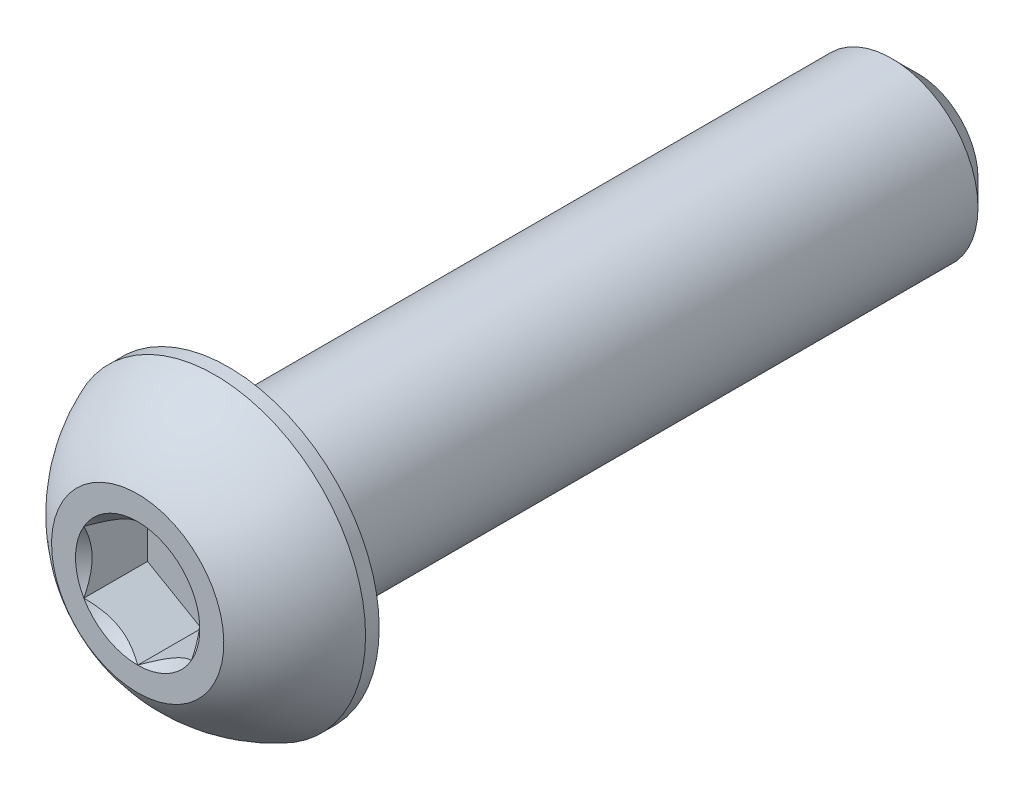
ISO-10303-21;
HEADER;
FILE_DESCRIPTION(('STEP AP214'),'2;1');
FILE_NAME('part.step','',(''),(''),'','','');
FILE_SCHEMA(('AUTOMOTIVE_DESIGN { 1 0 10303 214 1 1 1 1 }'));
ENDSEC;
DATA;
#1=APPLICATION_CONTEXT('core data for automotive mechanical design processes');
#2=APPLICATION_PROTOCOL_DEFINITION('international standard','automotive_design',2000,#1);
#3=PRODUCT_CONTEXT('',#1,'mechanical');
#4=PRODUCT('Part','Part','',(#3));
#5=PRODUCT_RELATED_PRODUCT_CATEGORY('part','',(#4));
#6=PRODUCT_DEFINITION_FORMATION('','',#4);
#7=PRODUCT_DEFINITION_CONTEXT('part definition',#1,'design');
#8=PRODUCT_DEFINITION('design','',#6,#7);
#9=PRODUCT_DEFINITION_SHAPE('','',#8);
#10=(LENGTH_UNIT() NAMED_UNIT(*) SI_UNIT(.MILLI.,.METRE.));
#11=(NAMED_UNIT(*) PLANE_ANGLE_UNIT() SI_UNIT($,.RADIAN.));
#12=(NAMED_UNIT(*) SI_UNIT($,.STERADIAN.) SOLID_ANGLE_UNIT());
#13=UNCERTAINTY_MEASURE_WITH_UNIT(LENGTH_MEASURE(1.E-05),#10,'distance_accuracy_value','');
#14=(GEOMETRIC_REPRESENTATION_CONTEXT(3) GLOBAL_UNCERTAINTY_ASSIGNED_CONTEXT((#13)) GLOBAL_UNIT_ASSIGNED_CONTEXT((#10,
#11,#12)) REPRESENTATION_CONTEXT('',''));
#15=CARTESIAN_POINT('',(0.,0.,0.));
#16=DIRECTION('',(0.,0.,1.));
#17=DIRECTION('',(1.,0.,0.));
#18=AXIS2_PLACEMENT_3D('',#15,#16,#17);
#19=CARTESIAN_POINT('',(0.,-3.175,-28.7528));
#20=DIRECTION('',(0.,0.,-1.));
#21=DIRECTION('',(0.,1.,0.));
#22=AXIS2_PLACEMENT_3D('',#19,#20,#21);
#23=PLANE('',#22);
#24=CARTESIAN_POINT('',(0.,0.,-28.7528));
#25=DIRECTION('',(0.,0.,-1.));
#26=DIRECTION('',(0.,1.,0.));
#27=AXIS2_PLACEMENT_3D('',#24,#25,#26);
#28=CIRCLE('',#27,2.22250000000001);
#29=CARTESIAN_POINT('',(0.,-2.2225,-28.7528));
#30=VERTEX_POINT('',#29);
#31=EDGE_CURVE('E175',#30,#30,#28,.T.);
#32=ORIENTED_EDGE('',*,*,#31,.T.);
#33=EDGE_LOOP('',(#32));
#34=FACE_BOUND('',#33,.T.);
#35=ADVANCED_FACE('F35',(#34),#23,.T.);
#36=CARTESIAN_POINT('',(0.,0.,-28.7528));
#37=DIRECTION('',(0.,0.,-1.));
#38=DIRECTION('',(0.,1.,0.));
#39=AXIS2_PLACEMENT_3D('',#36,#37,#38);
#40=CYLINDRICAL_SURFACE('',#39,3.175);
#41=CARTESIAN_POINT('',(0.,0.,-27.8003));
#42=DIRECTION('',(0.,0.,-1.));
#43=DIRECTION('',(0.,1.,0.));
#44=AXIS2_PLACEMENT_3D('',#41,#42,#43);
#45=CIRCLE('',#44,3.175);
#46=CARTESIAN_POINT('',(0.,-3.175,-27.8003));
#47=VERTEX_POINT('',#46);
#48=EDGE_CURVE('E49',#47,#47,#45,.F.);
#49=ORIENTED_EDGE('',*,*,#48,.T.);
#50=EDGE_LOOP('',(#49));
#51=FACE_BOUND('',#50,.T.);
#52=CARTESIAN_POINT('',(0.,0.,-3.3528));
#53=DIRECTION('',(0.,0.,1.));
#54=DIRECTION('',(1.,0.,0.));
#55=AXIS2_PLACEMENT_3D('',#52,#53,#54);
#56=CIRCLE('',#55,3.175);
#57=CARTESIAN_POINT('',(3.175,0.,-3.3528));
#58=VERTEX_POINT('',#57);
#59=EDGE_CURVE('E172',#58,#58,#56,.F.);
#60=ORIENTED_EDGE('',*,*,#59,.T.);
#61=EDGE_LOOP('',(#60));
#62=FACE_BOUND('',#61,.T.);
#63=ADVANCED_FACE('F180',(#51,#62),#40,.T.);
#64=CARTESIAN_POINT('',(0.,0.,-28.7528));
#65=DIRECTION('',(0.,0.,1.));
#66=DIRECTION('',(0.,-1.,0.));
#67=AXIS2_PLACEMENT_3D('',#64,#65,#66);
#68=CONICAL_SURFACE('',#67,2.22250000000001,0.785398163397445);
#69=CARTESIAN_POINT('',(0.,-3.175,-27.8003));
#70=CARTESIAN_POINT('',(0.,-3.165078125,-27.810221875));
#71=CARTESIAN_POINT('',(0.,-3.15515625,-27.82014375));
#72=CARTESIAN_POINT('',(0.,-3.1353125,-27.8399875));
#73=CARTESIAN_POINT('',(0.,-3.125390625,-27.849909375));
#74=CARTESIAN_POINT('',(0.,-3.105546875,-27.869753125));
#75=CARTESIAN_POINT('',(0.,-3.095625,-27.879675));
#76=CARTESIAN_POINT('',(0.,-3.07578125,-27.89951875));
#77=CARTESIAN_POINT('',(0.,-3.065859375,-27.909440625));
#78=CARTESIAN_POINT('',(0.,-3.046015625,-27.929284375));
#79=CARTESIAN_POINT('',(0.,-3.03609375,-27.93920625));
#80=CARTESIAN_POINT('',(0.,-3.01625,-27.95905));
#81=CARTESIAN_POINT('',(0.,-3.006328125,-27.968971875));
#82=CARTESIAN_POINT('',(0.,-2.986484375,-27.988815625));
#83=CARTESIAN_POINT('',(0.,-2.9765625,-27.9987375));
#84=CARTESIAN_POINT('',(0.,-2.95671875,-28.01858125));
#85=CARTESIAN_POINT('',(0.,-2.946796875,-28.028503125));
#86=CARTESIAN_POINT('',(0.,-2.926953125,-28.048346875));
#87=CARTESIAN_POINT('',(0.,-2.91703125,-28.05826875));
#88=CARTESIAN_POINT('',(0.,-2.8971875,-28.0781125));
#89=CARTESIAN_POINT('',(0.,-2.887265625,-28.088034375));
#90=CARTESIAN_POINT('',(0.,-2.867421875,-28.107878125));
#91=CARTESIAN_POINT('',(0.,-2.8575,-28.1178));
#92=CARTESIAN_POINT('',(0.,-2.83765625,-28.13764375));
#93=CARTESIAN_POINT('',(0.,-2.827734375,-28.147565625));
#94=CARTESIAN_POINT('',(0.,-2.807890625,-28.167409375));
#95=CARTESIAN_POINT('',(0.,-2.79796875,-28.17733125));
#96=CARTESIAN_POINT('',(0.,-2.778125,-28.197175));
#97=CARTESIAN_POINT('',(0.,-2.768203125,-28.207096875));
#98=CARTESIAN_POINT('',(0.,-2.748359375,-28.226940625));
#99=CARTESIAN_POINT('',(0.,-2.7384375,-28.2368625));
#100=CARTESIAN_POINT('',(0.,-2.71859375,-28.25670625));
#101=CARTESIAN_POINT('',(0.,-2.708671875,-28.266628125));
#102=CARTESIAN_POINT('',(0.,-2.688828125,-28.286471875));
#103=CARTESIAN_POINT('',(0.,-2.67890625,-28.29639375));
#104=CARTESIAN_POINT('',(0.,-2.6590625,-28.3162375));
#105=CARTESIAN_POINT('',(0.,-2.649140625,-28.326159375));
#106=CARTESIAN_POINT('',(0.,-2.629296875,-28.346003125));
#107=CARTESIAN_POINT('',(0.,-2.619375,-28.355925));
#108=CARTESIAN_POINT('',(0.,-2.59953125,-28.37576875));
#109=CARTESIAN_POINT('',(0.,-2.589609375,-28.385690625));
#110=CARTESIAN_POINT('',(0.,-2.569765625,-28.405534375));
#111=CARTESIAN_POINT('',(0.,-2.55984375,-28.41545625));
#112=CARTESIAN_POINT('',(0.,-2.54,-28.4353));
#113=CARTESIAN_POINT('',(0.,-2.530078125,-28.445221875));
#114=CARTESIAN_POINT('',(0.,-2.510234375,-28.465065625));
#115=CARTESIAN_POINT('',(0.,-2.5003125,-28.4749875));
#116=CARTESIAN_POINT('',(0.,-2.48046875,-28.49483125));
#117=CARTESIAN_POINT('',(0.,-2.470546875,-28.504753125));
#118=CARTESIAN_POINT('',(0.,-2.450703125,-28.524596875));
#119=CARTESIAN_POINT('',(0.,-2.44078125,-28.53451875));
#120=CARTESIAN_POINT('',(0.,-2.4209375,-28.5543625));
#121=CARTESIAN_POINT('',(0.,-2.411015625,-28.564284375));
#122=CARTESIAN_POINT('',(0.,-2.391171875,-28.584128125));
#123=CARTESIAN_POINT('',(0.,-2.38125,-28.59405));
#124=CARTESIAN_POINT('',(0.,-2.36140625,-28.61389375));
#125=CARTESIAN_POINT('',(0.,-2.351484375,-28.623815625));
#126=CARTESIAN_POINT('',(0.,-2.331640625,-28.643659375));
#127=CARTESIAN_POINT('',(0.,-2.32171875,-28.65358125));
#128=CARTESIAN_POINT('',(0.,-2.301875,-28.673425));
#129=CARTESIAN_POINT('',(0.,-2.291953125,-28.683346875));
#130=CARTESIAN_POINT('',(0.,-2.272109375,-28.703190625));
#131=CARTESIAN_POINT('',(0.,-2.2621875,-28.7131125));
#132=CARTESIAN_POINT('',(0.,-2.24234375,-28.73295625));
#133=CARTESIAN_POINT('',(0.,-2.232421875,-28.742878125));
#134=CARTESIAN_POINT('',(0.,-2.2225,-28.7528));
#135=B_SPLINE_CURVE_WITH_KNOTS('',3,(#69,#70,#71,#72,#73,#74,#75,#76,#77,#78,#79,#80,#81,#82,
#83,#84,#85,#86,#87,#88,#89,#90,#91,#92,#93,#94,#95,#96,#97,#98,#99,#100,#101,#102,#103,#104,
#105,#106,#107,#108,#109,#110,#111,#112,#113,#114,#115,#116,#117,#118,#119,#120,#121,#122,#123,
#124,#125,#126,#127,#128,#129,#130,#131,#132,#133,#134),.UNSPECIFIED.,.F.,.F.,(4,2,2,2,2,2,2,2,
2,2,2,2,2,2,2,2,2,2,2,2,2,2,2,2,2,2,2,2,2,2,2,2,4),(0.,0.042094950567512,0.0841899011350244,
0.126284851702536,0.168379802270049,0.210474752837561,0.25256970340507,0.294664653972582,
0.336759604540094,0.378854555107606,0.420949505675118,0.463044456242628,0.50513940681014,
0.547234357377652,0.589329307945164,0.631424258512676,0.673519209080186,0.715614159647698,
0.75770911021521,0.799804060782722,0.841899011350235,0.883993961917747,0.926088912485256,
0.968183863052768,1.01027881362028,1.05237376418779,1.0944687147553,1.13656366532281,
1.17865861589033,1.22075356645784,1.26284851702535,1.30494346759286,1.34703841816037),.UNSPECIFIED.);
#136=EDGE_CURVE('BSEAM37',#47,#30,#135,.T.);
#137=ORIENTED_EDGE('',*,*,#48,.F.);
#138=ORIENTED_EDGE('',*,*,#31,.F.);
#139=ORIENTED_EDGE('',*,*,#136,.T.);
#140=ORIENTED_EDGE('',*,*,#136,.F.);
#141=EDGE_LOOP('',(#137,#139,#138,#140));
#142=FACE_BOUND('',#141,.T.);
#143=ADVANCED_FACE('F37',(#142),#68,.T.);
#144=CARTESIAN_POINT('',(0.,0.,-5.060315));
#145=DIRECTION('',(0.,0.,1.));
#146=DIRECTION('',(0.,-1.,0.));
#147=AXIS2_PLACEMENT_3D('',#144,#145,#146);
#148=SPHERICAL_SURFACE('',#147,5.97389428256184);
#149=CARTESIAN_POINT('',(0.,0.,0.));
#150=DIRECTION('',(0.,0.,1.));
#151=DIRECTION('',(1.,0.,0.));
#152=AXIS2_PLACEMENT_3D('',#149,#150,#151);
#153=CIRCLE('',#152,3.175);
#154=CARTESIAN_POINT('',(0.,-3.175,0.));
#155=VERTEX_POINT('',#154);
#156=EDGE_CURVE('E169',#155,#155,#153,.T.);
#157=CARTESIAN_POINT('',(0.,0.,-2.84988));
#158=DIRECTION('',(0.,0.,1.));
#159=DIRECTION('',(1.,0.,0.));
#160=AXIS2_PLACEMENT_3D('',#157,#158,#159);
#161=CIRCLE('',#160,5.5499);
#162=CARTESIAN_POINT('',(0.,-5.5499,-2.84988));
#163=VERTEX_POINT('',#162);
#164=EDGE_CURVE('E163',#163,#163,#161,.T.);
#165=CARTESIAN_POINT('',(0.,-3.175,0.));
#166=CARTESIAN_POINT('',(0.,-3.20828343957184,-0.0208830076580502));
#167=CARTESIAN_POINT('',(0.,-3.24136078860705,-0.0420944789280503));
#168=CARTESIAN_POINT('',(0.,-3.30709055775141,-0.0851658910984718));
#169=CARTESIAN_POINT('',(0.,-3.33974297786056,-0.107025831998893));
#170=CARTESIAN_POINT('',(0.,-3.40461014130008,-0.151385725836676));
#171=CARTESIAN_POINT('',(0.,-3.43682488463043,-0.173885678774039));
#172=CARTESIAN_POINT('',(0.,-3.50080416139461,-0.219516822259479));
#173=CARTESIAN_POINT('',(0.,-3.53256869482844,-0.242648012807557));
#174=CARTESIAN_POINT('',(0.,-3.59563518208834,-0.289532629449102));
#175=CARTESIAN_POINT('',(0.,-3.62693713591442,-0.313286055542569));
#176=CARTESIAN_POINT('',(0.,-3.68906627753106,-0.36140589409133));
#177=CARTESIAN_POINT('',(0.,-3.71989346532163,-0.385772306546626));
#178=CARTESIAN_POINT('',(0.,-3.78106107243204,-0.435108631276877));
#179=CARTESIAN_POINT('',(0.,-3.8114014917519,-0.460078543551833));
#180=CARTESIAN_POINT('',(0.,-3.87158374923259,-0.510612146063938));
#181=CARTESIAN_POINT('',(0.,-3.90142558739343,-0.536175836301086));
#182=CARTESIAN_POINT('',(0.,-3.96059906392414,-0.587887041792083));
#183=CARTESIAN_POINT('',(0.,-3.989930702294,-0.614034557045931));
#184=CARTESIAN_POINT('',(0.,-4.04807235926832,-0.666903232293407));
#185=CARTESIAN_POINT('',(0.,-4.07688237787279,-0.693624392287034));
#186=CARTESIAN_POINT('',(0.,-4.13396957842491,-0.747629953401057));
#187=CARTESIAN_POINT('',(0.,-4.16224676037257,-0.774914354521453));
#188=CARTESIAN_POINT('',(0.,-4.21825727817542,-0.830035774981947));
#189=CARTESIAN_POINT('',(0.,-4.24599061403061,-0.857872794322045));
#190=CARTESIAN_POINT('',(0.,-4.30090264195357,-0.91408861315902));
#191=CARTESIAN_POINT('',(0.,-4.32808133402134,-0.942467412655899));
#192=CARTESIAN_POINT('',(0.,-4.38187349261953,-0.999755742806741));
#193=CARTESIAN_POINT('',(0.,-4.40848695914995,-1.0286652734607));
#194=CARTESIAN_POINT('',(0.,-4.46113830498838,-1.08700381029123));
#195=CARTESIAN_POINT('',(0.,-4.48717618429639,-1.11643281646778));
#196=CARTESIAN_POINT('',(0.,-4.53866621810402,-1.17579884645643));
#197=CARTESIAN_POINT('',(0.,-4.56411837260364,-1.20573587026853));
#198=CARTESIAN_POINT('',(0.,-4.61442704725457,-1.26610627984964));
#199=CARTESIAN_POINT('',(0.,-4.63928356740587,-1.29653966561866));
#200=CARTESIAN_POINT('',(0.,-4.68839129572448,-1.3578909501815));
#201=CARTESIAN_POINT('',(0.,-4.71264250389178,-1.38880884897531));
#202=CARTESIAN_POINT('',(0.,-4.76053016627881,-1.45111712201534));
#203=CARTESIAN_POINT('',(0.,-4.78416662049853,-1.48250749626155));
#204=CARTESIAN_POINT('',(0.,-4.8308155723751,-1.54574849868041));
#205=CARTESIAN_POINT('',(0.,-4.85382807003194,-1.57759912685306));
#206=CARTESIAN_POINT('',(0.,-4.89922014909859,-1.64174823640362));
#207=CARTESIAN_POINT('',(0.,-4.92159973050841,-1.67404671778154));
#208=CARTESIAN_POINT('',(0.,-4.96571726381658,-1.73907895865427));
#209=CARTESIAN_POINT('',(0.,-4.98745521571493,-1.77181271814908));
#210=CARTESIAN_POINT('',(0.,-5.03028102654719,-1.83770277069632));
#211=CARTESIAN_POINT('',(0.,-5.0513688854811,-1.87085906374874));
#212=CARTESIAN_POINT('',(0.,-5.09288630004063,-1.93758127434189));
#213=CARTESIAN_POINT('',(0.,-5.11331585566624,-1.97114719188261));
#214=CARTESIAN_POINT('',(0.,-5.15350870956168,-2.03867558290299));
#215=CARTESIAN_POINT('',(0.,-5.17327200783151,-2.07263805638265));
#216=CARTESIAN_POINT('',(0.,-5.21212465239608,-2.14094633632486));
#217=CARTESIAN_POINT('',(0.,-5.23121399869082,-2.17529214278741));
#218=CARTESIAN_POINT('',(0.,-5.26871130697935,-2.2443537165359));
#219=CARTESIAN_POINT('',(0.,-5.28711926897315,-2.27906948382184));
#220=CARTESIAN_POINT('',(0.,-5.32324664200827,-2.3488574628552));
#221=CARTESIAN_POINT('',(0.,-5.3409660530496,-2.38392967460262));
#222=CARTESIAN_POINT('',(0.,-5.37570942417474,-2.45441688802313));
#223=CARTESIAN_POINT('',(0.,-5.39273338425856,-2.48983188969622));
#224=CARTESIAN_POINT('',(0.,-5.42607922958184,-2.56099089271574));
#225=CARTESIAN_POINT('',(0.,-5.44240111482132,-2.59673489406217));
#226=CARTESIAN_POINT('',(0.,-5.47433643994316,-2.66853798649801));
#227=CARTESIAN_POINT('',(0.,-5.48994987982553,-2.70459707758742));
#228=CARTESIAN_POINT('',(0.,-5.52046229408188,-2.77701628549785));
#229=CARTESIAN_POINT('',(0.,-5.53536126845586,-2.81337640231887));
#230=CARTESIAN_POINT('',(0.,-5.5499,-2.84988));
#231=B_SPLINE_CURVE_WITH_KNOTS('',3,(#165,#166,#167,#168,#169,#170,#171,#172,#173,#174,#175,
#176,#177,#178,#179,#180,#181,#182,#183,#184,#185,#186,#187,#188,#189,#190,#191,#192,#193,#194,
#195,#196,#197,#198,#199,#200,#201,#202,#203,#204,#205,#206,#207,#208,#209,#210,#211,#212,#213,
#214,#215,#216,#217,#218,#219,#220,#221,#222,#223,#224,#225,#226,#227,#228,#229,#230),
.UNSPECIFIED.,.F.,.F.,(4,2,2,2,2,2,2,2,2,2,2,2,2,2,2,2,2,2,2,2,2,2,2,2,2,2,2,2,2,2,2,2,4),(0.,
0.1178750807537,0.235750161507399,0.353625242261099,0.471500323014798,0.589375403768498,
0.707250484522198,0.825125565275897,0.943000646029597,1.0608757267833,1.17875080753699,
1.2966258882907,1.41450096904439,1.53237604979809,1.65025113055179,1.76812621130549,
1.88600129205919,2.00387637281289,2.12175145356659,2.23962653432029,2.35750161507399,
2.47537669582769,2.59325177658139,2.71112685733509,2.82900193808879,2.94687701884249,
3.06475209959619,3.18262718034989,3.30050226110359,3.41837734185729,3.53625242261099,
3.65412750336469,3.77200258411839),.UNSPECIFIED.);
#232=EDGE_CURVE('BSEAM185',#155,#163,#231,.T.);
#233=ORIENTED_EDGE('',*,*,#156,.F.);
#234=ORIENTED_EDGE('',*,*,#164,.T.);
#235=ORIENTED_EDGE('',*,*,#232,.T.);
#236=ORIENTED_EDGE('',*,*,#232,.F.);
#237=EDGE_LOOP('',(#233,#235,#234,#236));
#238=FACE_BOUND('',#237,.T.);
#239=ADVANCED_FACE('F185',(#238),#148,.T.);
#240=CARTESIAN_POINT('',(0.,-3.175,0.));
#241=DIRECTION('',(0.,0.,-1.));
#242=DIRECTION('',(-1.,0.,0.));
#243=AXIS2_PLACEMENT_3D('',#240,#241,#242);
#244=PLANE('',#243);
#245=CARTESIAN_POINT('',(0.,0.,0.));
#246=DIRECTION('',(0.,0.,1.));
#247=DIRECTION('',(1.,0.,0.));
#248=AXIS2_PLACEMENT_3D('',#245,#246,#247);
#249=CIRCLE('',#248,2.29135888084633);
#250=CARTESIAN_POINT('',(-1.984375,1.14567944042316,0.));
#251=VERTEX_POINT('',#250);
#252=CARTESIAN_POINT('',(-1.984375,-1.14567944042316,0.));
#253=VERTEX_POINT('',#252);
#254=EDGE_CURVE('E62',#251,#253,#249,.T.);
#255=ORIENTED_EDGE('',*,*,#254,.F.);
#256=CARTESIAN_POINT('',(0.,2.29135888084633,0.));
#257=VERTEX_POINT('',#256);
#258=EDGE_CURVE('E134',#257,#251,#249,.T.);
#259=ORIENTED_EDGE('',*,*,#258,.F.);
#260=CARTESIAN_POINT('',(1.984375,1.14567944042316,0.));
#261=VERTEX_POINT('',#260);
#262=EDGE_CURVE('E131',#261,#257,#249,.T.);
#263=ORIENTED_EDGE('',*,*,#262,.F.);
#264=CARTESIAN_POINT('',(1.984375,-1.14567944042316,0.));
#265=VERTEX_POINT('',#264);
#266=EDGE_CURVE('E102',#265,#261,#249,.T.);
#267=ORIENTED_EDGE('',*,*,#266,.F.);
#268=CARTESIAN_POINT('',(0.,-2.29135888084633,0.));
#269=VERTEX_POINT('',#268);
#270=EDGE_CURVE('E94',#269,#265,#249,.T.);
#271=ORIENTED_EDGE('',*,*,#270,.F.);
#272=EDGE_CURVE('E55',#253,#269,#249,.T.);
#273=ORIENTED_EDGE('',*,*,#272,.F.);
#274=EDGE_LOOP('',(#255,#259,#263,#267,#271,#273));
#275=FACE_BOUND('',#274,.T.);
#276=ORIENTED_EDGE('',*,*,#156,.T.);
#277=EDGE_LOOP('',(#276));
#278=FACE_BOUND('',#277,.T.);
#279=ADVANCED_FACE('F128',(#275,#278),#244,.F.);
#280=CARTESIAN_POINT('',(0.,-5.5499,-3.3528));
#281=DIRECTION('',(0.,0.,1.));
#282=DIRECTION('',(1.,0.,0.));
#283=AXIS2_PLACEMENT_3D('',#280,#281,#282);
#284=PLANE('',#283);
#285=ORIENTED_EDGE('',*,*,#59,.F.);
#286=EDGE_LOOP('',(#285));
#287=FACE_BOUND('',#286,.T.);
#288=CARTESIAN_POINT('',(0.,0.,-3.3528));
#289=DIRECTION('',(0.,0.,1.));
#290=DIRECTION('',(1.,0.,0.));
#291=AXIS2_PLACEMENT_3D('',#288,#289,#290);
#292=CIRCLE('',#291,5.5499);
#293=CARTESIAN_POINT('',(5.5499,0.,-3.3528));
#294=VERTEX_POINT('',#293);
#295=EDGE_CURVE('E166',#294,#294,#292,.T.);
#296=ORIENTED_EDGE('',*,*,#295,.F.);
#297=EDGE_LOOP('',(#296));
#298=FACE_BOUND('',#297,.T.);
#299=ADVANCED_FACE('F199',(#287,#298),#284,.F.);
#300=CARTESIAN_POINT('',(0.,0.,0.));
#301=DIRECTION('',(0.,0.,1.));
#302=DIRECTION('',(1.,0.,0.));
#303=AXIS2_PLACEMENT_3D('',#300,#301,#302);
#304=CYLINDRICAL_SURFACE('',#303,5.5499);
#305=ORIENTED_EDGE('',*,*,#164,.F.);
#306=EDGE_LOOP('',(#305));
#307=FACE_BOUND('',#306,.T.);
#308=ORIENTED_EDGE('',*,*,#295,.T.);
#309=EDGE_LOOP('',(#308));
#310=FACE_BOUND('',#309,.T.);
#311=ADVANCED_FACE('F202',(#307,#310),#304,.T.);
#312=CARTESIAN_POINT('',(0.,0.,0.));
#313=DIRECTION('',(0.,0.,1.));
#314=DIRECTION('',(1.,0.,0.));
#315=AXIS2_PLACEMENT_3D('',#312,#313,#314);
#316=CONICAL_SURFACE('',#315,2.29135888084633,0.78539816339745);
#317=ORIENTED_EDGE('',*,*,#266,.T.);
#318=CARTESIAN_POINT('',(1.984375,-2.28495242157822,0.734984078816568));
#319=CARTESIAN_POINT('',(1.984375,-2.22931635455402,0.692986685550762));
#320=CARTESIAN_POINT('',(1.984375,-2.17336876548389,0.651396054076336));
#321=CARTESIAN_POINT('',(1.984375,-2.06072770258171,0.569208461471479));
#322=CARTESIAN_POINT('',(1.984375,-2.00403404503435,0.528611752405042));
#323=CARTESIAN_POINT('',(1.984375,-1.88936329173488,0.448303503174668));
#324=CARTESIAN_POINT('',(1.984375,-1.83137965519348,0.408601258813307));
#325=CARTESIAN_POINT('',(1.984375,-1.7144280213784,0.330685173401292));
#326=CARTESIAN_POINT('',(1.984375,-1.65546009407228,0.292471227194368));
#327=CARTESIAN_POINT('',(1.984375,-1.47005472306035,0.176252834013637));
#328=CARTESIAN_POINT('',(1.984375,-1.34163909427883,0.101347886872381));
#329=CARTESIAN_POINT('',(1.984375,-1.0784038470548,-0.0356697845602627));
#330=CARTESIAN_POINT('',(1.984375,-0.943607781407424,-0.0978256335176254));
#331=CARTESIAN_POINT('',(1.984375,-0.741275100444881,-0.173867421311381));
#332=CARTESIAN_POINT('',(1.984375,-0.676735408881095,-0.195691938673995));
#333=CARTESIAN_POINT('',(1.984375,-0.546098118112761,-0.234159536462205));
#334=CARTESIAN_POINT('',(1.984375,-0.480000411919955,-0.250802259934452));
#335=CARTESIAN_POINT('',(1.984375,-0.347746170028531,-0.277764619130277));
#336=CARTESIAN_POINT('',(1.984375,-0.281612071479122,-0.288192590264109));
#337=CARTESIAN_POINT('',(1.984375,-0.14863662005235,-0.302521852623404));
#338=CARTESIAN_POINT('',(1.984375,-0.0817953907393235,-0.306424265772614));
#339=CARTESIAN_POINT('',(1.984375,0.0495156750890644,-0.307412948667327));
#340=CARTESIAN_POINT('',(1.984375,0.113983775102991,-0.304740821124985));
#341=CARTESIAN_POINT('',(1.984375,0.242367515846177,-0.293260789502485));
#342=CARTESIAN_POINT('',(1.984375,0.30628310229592,-0.284452289360786));
#343=CARTESIAN_POINT('',(1.984375,0.434181040262184,-0.261030978667103));
#344=CARTESIAN_POINT('',(1.984375,0.498145026858309,-0.246319393767914));
#345=CARTESIAN_POINT('',(1.984375,0.624675616953007,-0.211873818587874));
#346=CARTESIAN_POINT('',(1.984375,0.687242336899689,-0.192140248550805));
#347=CARTESIAN_POINT('',(1.984375,0.884225483826088,-0.12258776276924));
#348=CARTESIAN_POINT('',(1.984375,1.01583674256468,-0.0648475887435034));
#349=CARTESIAN_POINT('',(1.984375,1.27288659242652,0.063530336588798));
#350=CARTESIAN_POINT('',(1.984375,1.3983008827048,0.134214424919413));
#351=CARTESIAN_POINT('',(1.984375,1.57956687990221,0.244516663813199));
#352=CARTESIAN_POINT('',(1.984375,1.63738271299424,0.280969829475364));
#353=CARTESIAN_POINT('',(1.984375,1.75202215386202,0.355415963291705));
#354=CARTESIAN_POINT('',(1.984375,1.80884568601362,0.393409048078054));
#355=CARTESIAN_POINT('',(1.984375,1.92116923084255,0.470338808893091));
#356=CARTESIAN_POINT('',(1.984375,1.97667624512253,0.509265313038791));
#357=CARTESIAN_POINT('',(1.984375,2.08693170717166,0.588147746121386));
#358=CARTESIAN_POINT('',(1.984375,2.14168035934793,0.62810338902403));
#359=CARTESIAN_POINT('',(1.984375,2.19611149046622,0.668480611285427));
#360=B_SPLINE_CURVE_WITH_KNOTS('',3,(#318,#319,#320,#321,#322,#323,#324,#325,#326,#327,#328,
#329,#330,#331,#332,#333,#334,#335,#336,#337,#338,#339,#340,#341,#342,#343,#344,#345,#346,#347,
#348,#349,#350,#351,#352,#353,#354,#355,#356,#357,#358,#359),.UNSPECIFIED.,.F.,.F.,(4,2,2,2,2,2,
2,2,2,2,2,2,2,2,2,2,2,2,2,2,4),(0.,0.209126070008322,0.418304637356569,0.629103979977992,
0.839888401371185,1.28549951116127,1.72957750768351,1.93379389749971,2.13802435186698,
2.33858179514334,2.53910475350639,2.73236963400794,2.92565329006887,3.12231577097487,
3.31896180041345,3.74886295245172,4.18033428125362,4.3853601718029,4.59040161996383,
4.79377749165108,4.99709743524131),.UNSPECIFIED.);
#361=EDGE_CURVE('E11',#265,#261,#360,.T.);
#362=ORIENTED_EDGE('',*,*,#361,.F.);
#363=EDGE_LOOP('',(#317,#362));
#364=FACE_BOUND('',#363,.T.);
#365=ADVANCED_FACE('F106',(#364),#316,.F.);
#366=ORIENTED_EDGE('',*,*,#262,.T.);
#367=CARTESIAN_POINT('',(1.984575,1.14556397036933,0.000115478781843379));
#368=CARTESIAN_POINT('',(1.9163590048332,1.18494849354192,-0.0392371477360855));
#369=CARTESIAN_POINT('',(1.84700231489303,1.22499159714897,-0.0762786895538155));
#370=CARTESIAN_POINT('',(1.70557619954781,1.30664400291398,-0.144101141576677));
#371=CARTESIAN_POINT('',(1.63349332126322,1.34826107209555,-0.174844310908246));
#372=CARTESIAN_POINT('',(1.488141602734,1.43217992591557,-0.227508111188786));
#373=CARTESIAN_POINT('',(1.41490978751306,1.47446033414663,-0.249561124120036));
#374=CARTESIAN_POINT('',(1.26683381740529,1.55995203534886,-0.283538507056124));
#375=CARTESIAN_POINT('',(1.19199418724658,1.60316071596705,-0.295488243908271));
#376=CARTESIAN_POINT('',(1.06301458545618,1.6776271237807,-0.306269900918094));
#377=CARTESIAN_POINT('',(1.00904128422756,1.7087886237741,-0.30786610094093));
#378=CARTESIAN_POINT('',(0.901182881480199,1.77106070163465,-0.305178161134708));
#379=CARTESIAN_POINT('',(0.847297817514476,1.80217125782056,-0.300891959659541));
#380=CARTESIAN_POINT('',(0.740036461751395,1.86409863044402,-0.286683126986481));
#381=CARTESIAN_POINT('',(0.686660807239859,1.89491507894443,-0.276754189547727));
#382=CARTESIAN_POINT('',(0.580832482591103,1.95601509066828,-0.251804915725461));
#383=CARTESIAN_POINT('',(0.528379742028898,1.9862986945516,-0.236784969610512));
#384=CARTESIAN_POINT('',(0.394017661036351,2.06387267818152,-0.19219214836433));
#385=CARTESIAN_POINT('',(0.312941642841675,2.11068193911104,-0.159257004061667));
#386=CARTESIAN_POINT('',(0.19372669327016,2.17951072233758,-0.103657558797803));
#387=CARTESIAN_POINT('',(0.154440075613998,2.20219286161692,-0.0841224079481375));
#388=CARTESIAN_POINT('',(0.0765946381319467,2.24713694590237,-0.0432712618805984));
#389=CARTESIAN_POINT('',(0.0380353888983008,2.26939913882716,-0.0219563604316496));
#390=CARTESIAN_POINT('',(-0.00020000000000058,2.29147435090017,0.000115478781842942));
#391=B_SPLINE_CURVE_WITH_KNOTS('',3,(#367,#368,#369,#370,#371,#372,#373,#374,#375,#376,#377,
#378,#379,#380,#381,#382,#383,#384,#385,#386,#387,#388,#389,#390),.UNSPECIFIED.,.F.,.F.,(4,2,2,
2,2,2,2,2,2,2,2,4),(0.,0.264339630306627,0.530219665093694,0.79187641637146,1.05287424418109,
1.239639843932,1.42647091743852,1.61351120244035,1.8005371524754,2.09764209964316,
2.24579179873714,2.39385111134157),.UNSPECIFIED.);
#392=EDGE_CURVE('E133',#261,#257,#391,.T.);
#393=ORIENTED_EDGE('',*,*,#392,.F.);
#394=EDGE_LOOP('',(#366,#393));
#395=FACE_BOUND('',#394,.T.);
#396=ADVANCED_FACE('F287',(#395),#316,.F.);
#397=ORIENTED_EDGE('',*,*,#258,.T.);
#398=CARTESIAN_POINT('',(0.000199999999999608,2.29147435090017,0.000115478781843248));
#399=CARTESIAN_POINT('',(-0.0680159951668025,2.25208982772757,-0.0392371477360854));
#400=CARTESIAN_POINT('',(-0.137372685106966,2.21204672412052,-0.0762786895538155));
#401=CARTESIAN_POINT('',(-0.278798800452188,2.13039431835551,-0.144101141576677));
#402=CARTESIAN_POINT('',(-0.350881678736783,2.08877724917394,-0.174844310908246));
#403=CARTESIAN_POINT('',(-0.496233397266004,2.00485839535392,-0.227508111188786));
#404=CARTESIAN_POINT('',(-0.569465212486939,1.96257798712287,-0.249561124120036));
#405=CARTESIAN_POINT('',(-0.717541182594707,1.87708628592063,-0.283538507056124));
#406=CARTESIAN_POINT('',(-0.792380812753425,1.83387760530244,-0.295488243908272));
#407=CARTESIAN_POINT('',(-0.921360414543816,1.75941119748879,-0.306269900918094));
#408=CARTESIAN_POINT('',(-0.975333715772443,1.72824969749539,-0.307866100940931));
#409=CARTESIAN_POINT('',(-1.0831921185198,1.66597761963484,-0.305178161134708));
#410=CARTESIAN_POINT('',(-1.13707718248552,1.63486706344893,-0.300891959659541));
#411=CARTESIAN_POINT('',(-1.2443385382486,1.57293969082547,-0.286683126986481));
#412=CARTESIAN_POINT('',(-1.29771419276014,1.54212324232506,-0.276754189547727));
#413=CARTESIAN_POINT('',(-1.4035425174089,1.48102323060122,-0.251804915725462));
#414=CARTESIAN_POINT('',(-1.4559952579711,1.45073962671789,-0.236784969610512));
#415=CARTESIAN_POINT('',(-1.59035733896365,1.37316564308797,-0.19219214836433));
#416=CARTESIAN_POINT('',(-1.67143335715832,1.32635638215845,-0.159257004061668));
#417=CARTESIAN_POINT('',(-1.79064830672984,1.25752759893191,-0.103657558797804));
#418=CARTESIAN_POINT('',(-1.829934924386,1.23484545965257,-0.0841224079481378));
#419=CARTESIAN_POINT('',(-1.90778036186805,1.18990137536712,-0.0432712618805986));
#420=CARTESIAN_POINT('',(-1.9463396111017,1.16763918244233,-0.0219563604316498));
#421=CARTESIAN_POINT('',(-1.984575,1.14556397036933,0.000115478781842511));
#422=B_SPLINE_CURVE_WITH_KNOTS('',3,(#398,#399,#400,#401,#402,#403,#404,#405,#406,#407,#408,
#409,#410,#411,#412,#413,#414,#415,#416,#417,#418,#419,#420,#421),.UNSPECIFIED.,.F.,.F.,(4,2,2,
2,2,2,2,2,2,2,2,4),(0.,0.264339630306627,0.530219665093694,0.791876416371461,1.05287424418109,
1.239639843932,1.42647091743852,1.61351120244035,1.8005371524754,2.09764209964316,
2.24579179873714,2.39385111134157),.UNSPECIFIED.);
#423=EDGE_CURVE('E138',#257,#251,#422,.T.);
#424=ORIENTED_EDGE('',*,*,#423,.F.);
#425=EDGE_LOOP('',(#397,#424));
#426=FACE_BOUND('',#425,.T.);
#427=ADVANCED_FACE('F141',(#426),#316,.F.);
#428=ORIENTED_EDGE('',*,*,#254,.T.);
#429=CARTESIAN_POINT('',(-1.984375,-2.28495242157823,0.734984078816569));
#430=CARTESIAN_POINT('',(-1.984375,-2.22931635455402,0.692986685550762));
#431=CARTESIAN_POINT('',(-1.984375,-2.17336876548389,0.651396054076336));
#432=CARTESIAN_POINT('',(-1.984375,-2.06072770258171,0.56920846147148));
#433=CARTESIAN_POINT('',(-1.984375,-2.00403404503435,0.528611752405043));
#434=CARTESIAN_POINT('',(-1.984375,-1.88936329173489,0.448303503174669));
#435=CARTESIAN_POINT('',(-1.984375,-1.83137965519348,0.408601258813308));
#436=CARTESIAN_POINT('',(-1.984375,-1.7144280213784,0.330685173401292));
#437=CARTESIAN_POINT('',(-1.984375,-1.65546009407228,0.292471227194368));
#438=CARTESIAN_POINT('',(-1.984375,-1.47005472306035,0.176252834013636));
#439=CARTESIAN_POINT('',(-1.984375,-1.34163909427883,0.101347886872382));
#440=CARTESIAN_POINT('',(-1.984375,-1.0784038470548,-0.0356697845602624));
#441=CARTESIAN_POINT('',(-1.984375,-0.943607781407425,-0.0978256335176256));
#442=CARTESIAN_POINT('',(-1.984375,-0.741275100444882,-0.173867421311381));
#443=CARTESIAN_POINT('',(-1.984375,-0.676735408881095,-0.195691938673995));
#444=CARTESIAN_POINT('',(-1.984375,-0.546098118112762,-0.234159536462205));
#445=CARTESIAN_POINT('',(-1.984375,-0.480000411919956,-0.250802259934452));
#446=CARTESIAN_POINT('',(-1.984375,-0.347746170028532,-0.277764619130277));
#447=CARTESIAN_POINT('',(-1.984375,-0.281612071479123,-0.288192590264108));
#448=CARTESIAN_POINT('',(-1.984375,-0.14863662005235,-0.302521852623404));
#449=CARTESIAN_POINT('',(-1.984375,-0.0817953907393237,-0.306424265772614));
#450=CARTESIAN_POINT('',(-1.984375,0.0495156750890643,-0.307412948667328));
#451=CARTESIAN_POINT('',(-1.984375,0.113983775102991,-0.304740821124985));
#452=CARTESIAN_POINT('',(-1.984375,0.242367515846177,-0.293260789502485));
#453=CARTESIAN_POINT('',(-1.984375,0.306283102295919,-0.284452289360786));
#454=CARTESIAN_POINT('',(-1.984375,0.434181040262184,-0.261030978667103));
#455=CARTESIAN_POINT('',(-1.984375,0.498145026858309,-0.246319393767914));
#456=CARTESIAN_POINT('',(-1.984375,0.624675616953007,-0.211873818587874));
#457=CARTESIAN_POINT('',(-1.984375,0.687242336899689,-0.192140248550805));
#458=CARTESIAN_POINT('',(-1.984375,0.884225483826087,-0.12258776276924));
#459=CARTESIAN_POINT('',(-1.984375,1.01583674256468,-0.0648475887435036));
#460=CARTESIAN_POINT('',(-1.984375,1.27288659242652,0.0635303365887976));
#461=CARTESIAN_POINT('',(-1.984375,1.3983008827048,0.134214424919412));
#462=CARTESIAN_POINT('',(-1.984375,1.57956687990221,0.244516663813198));
#463=CARTESIAN_POINT('',(-1.984375,1.63738271299424,0.280969829475363));
#464=CARTESIAN_POINT('',(-1.984375,1.75202215386202,0.355415963291704));
#465=CARTESIAN_POINT('',(-1.984375,1.80884568601362,0.393409048078054));
#466=CARTESIAN_POINT('',(-1.984375,1.92116923084255,0.47033880889309));
#467=CARTESIAN_POINT('',(-1.984375,1.97667624512253,0.509265313038791));
#468=CARTESIAN_POINT('',(-1.984375,2.08693170717166,0.588147746121386));
#469=CARTESIAN_POINT('',(-1.984375,2.14168035934793,0.628103389024029));
#470=CARTESIAN_POINT('',(-1.984375,2.19611149046622,0.668480611285426));
#471=B_SPLINE_CURVE_WITH_KNOTS('',3,(#429,#430,#431,#432,#433,#434,#435,#436,#437,#438,#439,
#440,#441,#442,#443,#444,#445,#446,#447,#448,#449,#450,#451,#452,#453,#454,#455,#456,#457,#458,
#459,#460,#461,#462,#463,#464,#465,#466,#467,#468,#469,#470),.UNSPECIFIED.,.F.,.F.,(4,2,2,2,2,2,
2,2,2,2,2,2,2,2,2,2,2,2,2,2,4),(0.,0.209126070008322,0.41830463735657,0.629103979977993,
0.839888401371186,1.28549951116127,1.72957750768351,1.93379389749972,2.13802435186698,
2.33858179514334,2.53910475350639,2.73236963400794,2.92565329006887,3.12231577097488,
3.31896180041345,3.74886295245172,4.18033428125362,4.3853601718029,4.59040161996383,
4.79377749165108,4.99709743524131),.UNSPECIFIED.);
#472=EDGE_CURVE('E145',#251,#253,#471,.F.);
#473=ORIENTED_EDGE('',*,*,#472,.F.);
#474=EDGE_LOOP('',(#428,#473));
#475=FACE_BOUND('',#474,.T.);
#476=ADVANCED_FACE('F281',(#475),#316,.F.);
#477=ORIENTED_EDGE('',*,*,#272,.T.);
#478=CARTESIAN_POINT('',(-1.984575,-1.14556397036933,0.000115478781843379));
#479=CARTESIAN_POINT('',(-1.9163590048332,-1.18494849354192,-0.0392371477360847));
#480=CARTESIAN_POINT('',(-1.84700231489303,-1.22499159714897,-0.0762786895538149));
#481=CARTESIAN_POINT('',(-1.70557619954781,-1.30664400291398,-0.144101141576677));
#482=CARTESIAN_POINT('',(-1.63349332126322,-1.34826107209555,-0.174844310908247));
#483=CARTESIAN_POINT('',(-1.488141602734,-1.43217992591557,-0.227508111188786));
#484=CARTESIAN_POINT('',(-1.41490978751306,-1.47446033414663,-0.249561124120036));
#485=CARTESIAN_POINT('',(-1.26683381740529,-1.55995203534886,-0.283538507056124));
#486=CARTESIAN_POINT('',(-1.19199418724658,-1.60316071596705,-0.295488243908271));
#487=CARTESIAN_POINT('',(-1.06301458545618,-1.6776271237807,-0.306269900918094));
#488=CARTESIAN_POINT('',(-1.00904128422756,-1.7087886237741,-0.30786610094093));
#489=CARTESIAN_POINT('',(-0.9011828814802,-1.77106070163465,-0.305178161134707));
#490=CARTESIAN_POINT('',(-0.847297817514477,-1.80217125782056,-0.30089195965954));
#491=CARTESIAN_POINT('',(-0.740036461751396,-1.86409863044402,-0.286683126986481));
#492=CARTESIAN_POINT('',(-0.68666080723986,-1.89491507894443,-0.276754189547727));
#493=CARTESIAN_POINT('',(-0.580832482591103,-1.95601509066828,-0.251804915725461));
#494=CARTESIAN_POINT('',(-0.528379742028898,-1.9862986945516,-0.236784969610511));
#495=CARTESIAN_POINT('',(-0.394017661036351,-2.06387267818152,-0.19219214836433));
#496=CARTESIAN_POINT('',(-0.312941642841675,-2.11068193911104,-0.159257004061667));
#497=CARTESIAN_POINT('',(-0.19372669327016,-2.17951072233758,-0.103657558797803));
#498=CARTESIAN_POINT('',(-0.154440075613998,-2.20219286161692,-0.0841224079481371));
#499=CARTESIAN_POINT('',(-0.0765946381319465,-2.24713694590237,-0.0432712618805977));
#500=CARTESIAN_POINT('',(-0.0380353888983009,-2.26939913882716,-0.0219563604316487));
#501=CARTESIAN_POINT('',(0.000200000000000425,-2.29147435090017,0.000115478781843735));
#502=B_SPLINE_CURVE_WITH_KNOTS('',3,(#478,#479,#480,#481,#482,#483,#484,#485,#486,#487,#488,
#489,#490,#491,#492,#493,#494,#495,#496,#497,#498,#499,#500,#501),.UNSPECIFIED.,.F.,.F.,(4,2,2,
2,2,2,2,2,2,2,2,4),(0.,0.264339630306627,0.530219665093694,0.79187641637146,1.05287424418109,
1.239639843932,1.42647091743852,1.61351120244035,1.8005371524754,2.09764209964316,
2.24579179873714,2.39385111134157),.UNSPECIFIED.);
#503=EDGE_CURVE('E118',#253,#269,#502,.T.);
#504=ORIENTED_EDGE('',*,*,#503,.F.);
#505=EDGE_LOOP('',(#477,#504));
#506=FACE_BOUND('',#505,.T.);
#507=ADVANCED_FACE('F229',(#506),#316,.F.);
#508=ORIENTED_EDGE('',*,*,#270,.T.);
#509=CARTESIAN_POINT('',(-0.000199999999999594,-2.29147435090017,0.000115478781843681));
#510=CARTESIAN_POINT('',(0.0680159951668032,-2.25208982772757,-0.0392371477360843));
#511=CARTESIAN_POINT('',(0.137372685106967,-2.21204672412052,-0.0762786895538144));
#512=CARTESIAN_POINT('',(0.278798800452188,-2.13039431835551,-0.144101141576676));
#513=CARTESIAN_POINT('',(0.350881678736783,-2.08877724917394,-0.174844310908246));
#514=CARTESIAN_POINT('',(0.496233397266004,-2.00485839535392,-0.227508111188787));
#515=CARTESIAN_POINT('',(0.569465212486939,-1.96257798712287,-0.249561124120036));
#516=CARTESIAN_POINT('',(0.717541182594707,-1.87708628592063,-0.283538507056124));
#517=CARTESIAN_POINT('',(0.792380812753425,-1.83387760530244,-0.295488243908272));
#518=CARTESIAN_POINT('',(0.921360414543816,-1.75941119748879,-0.306269900918094));
#519=CARTESIAN_POINT('',(0.975333715772443,-1.72824969749539,-0.30786610094093));
#520=CARTESIAN_POINT('',(1.0831921185198,-1.66597761963484,-0.305178161134708));
#521=CARTESIAN_POINT('',(1.13707718248552,-1.63486706344893,-0.300891959659541));
#522=CARTESIAN_POINT('',(1.2443385382486,-1.57293969082547,-0.286683126986481));
#523=CARTESIAN_POINT('',(1.29771419276014,-1.54212324232506,-0.276754189547727));
#524=CARTESIAN_POINT('',(1.4035425174089,-1.48102323060122,-0.251804915725462));
#525=CARTESIAN_POINT('',(1.4559952579711,-1.45073962671789,-0.236784969610512));
#526=CARTESIAN_POINT('',(1.59035733896365,-1.37316564308797,-0.19219214836433));
#527=CARTESIAN_POINT('',(1.67143335715832,-1.32635638215845,-0.159257004061668));
#528=CARTESIAN_POINT('',(1.79064830672984,-1.25752759893191,-0.103657558797804));
#529=CARTESIAN_POINT('',(1.829934924386,-1.23484545965257,-0.0841224079481379));
#530=CARTESIAN_POINT('',(1.90778036186805,-1.18990137536712,-0.0432712618805987));
#531=CARTESIAN_POINT('',(1.9463396111017,-1.16763918244233,-0.0219563604316498));
#532=CARTESIAN_POINT('',(1.984575,-1.14556397036933,0.000115478781842673));
#533=B_SPLINE_CURVE_WITH_KNOTS('',3,(#509,#510,#511,#512,#513,#514,#515,#516,#517,#518,#519,
#520,#521,#522,#523,#524,#525,#526,#527,#528,#529,#530,#531,#532),.UNSPECIFIED.,.F.,.F.,(4,2,2,
2,2,2,2,2,2,2,2,4),(0.,0.264339630306627,0.530219665093695,0.791876416371461,1.05287424418109,
1.239639843932,1.42647091743852,1.61351120244035,1.8005371524754,2.09764209964316,
2.24579179873714,2.39385111134157),.UNSPECIFIED.);
#534=EDGE_CURVE('E98',#269,#265,#533,.T.);
#535=ORIENTED_EDGE('',*,*,#534,.F.);
#536=EDGE_LOOP('',(#508,#535));
#537=FACE_BOUND('',#536,.T.);
#538=ADVANCED_FACE('F96',(#537),#316,.F.);
#539=CARTESIAN_POINT('',(1.984375,-1.14567944042316,-2.34696));
#540=DIRECTION('',(0.,0.,1.));
#541=DIRECTION('',(1.,0.,0.));
#542=AXIS2_PLACEMENT_3D('',#539,#540,#541);
#543=PLANE('',#542);
#544=DIRECTION('',(0.866025403784438,0.5,0.));
#545=VECTOR('',#544,1.);
#546=CARTESIAN_POINT('',(0.,-2.29135888084633,-2.34696));
#547=LINE('',#546,#545);
#548=CARTESIAN_POINT('',(0.,-2.29135888084633,-2.34696));
#549=VERTEX_POINT('',#548);
#550=CARTESIAN_POINT('',(1.984375,-1.14567944042316,-2.34696));
#551=VERTEX_POINT('',#550);
#552=EDGE_CURVE('E117',#549,#551,#547,.T.);
#553=ORIENTED_EDGE('',*,*,#552,.T.);
#554=DIRECTION('',(0.,1.,0.));
#555=VECTOR('',#554,1.);
#556=CARTESIAN_POINT('',(1.984375,-1.14567944042316,-2.34696));
#557=LINE('',#556,#555);
#558=CARTESIAN_POINT('',(1.984375,1.14567944042316,-2.34696));
#559=VERTEX_POINT('',#558);
#560=EDGE_CURVE('E122',#551,#559,#557,.T.);
#561=ORIENTED_EDGE('',*,*,#560,.T.);
#562=DIRECTION('',(-0.866025403784439,0.5,0.));
#563=VECTOR('',#562,1.);
#564=CARTESIAN_POINT('',(1.984375,1.14567944042316,-2.34696));
#565=LINE('',#564,#563);
#566=CARTESIAN_POINT('',(0.,2.29135888084633,-2.34696));
#567=VERTEX_POINT('',#566);
#568=EDGE_CURVE('E271',#559,#567,#565,.T.);
#569=ORIENTED_EDGE('',*,*,#568,.T.);
#570=DIRECTION('',(-0.866025403784438,-0.5,0.));
#571=VECTOR('',#570,1.);
#572=CARTESIAN_POINT('',(0.,2.29135888084633,-2.34696));
#573=LINE('',#572,#571);
#574=CARTESIAN_POINT('',(-1.984375,1.14567944042316,-2.34696));
#575=VERTEX_POINT('',#574);
#576=EDGE_CURVE('E154',#567,#575,#573,.T.);
#577=ORIENTED_EDGE('',*,*,#576,.T.);
#578=DIRECTION('',(0.,-1.,0.));
#579=VECTOR('',#578,1.);
#580=CARTESIAN_POINT('',(-1.984375,1.14567944042316,-2.34696));
#581=LINE('',#580,#579);
#582=CARTESIAN_POINT('',(-1.984375,-1.14567944042316,-2.34696));
#583=VERTEX_POINT('',#582);
#584=EDGE_CURVE('E275',#575,#583,#581,.T.);
#585=ORIENTED_EDGE('',*,*,#584,.T.);
#586=DIRECTION('',(0.866025403784439,-0.5,0.));
#587=VECTOR('',#586,1.);
#588=CARTESIAN_POINT('',(-1.984375,-1.14567944042316,-2.34696));
#589=LINE('',#588,#587);
#590=EDGE_CURVE('E125',#583,#549,#589,.T.);
#591=ORIENTED_EDGE('',*,*,#590,.T.);
#592=EDGE_LOOP('',(#553,#561,#569,#577,#585,#591));
#593=FACE_BOUND('',#592,.T.);
#594=ADVANCED_FACE('F228',(#593),#543,.T.);
#595=CARTESIAN_POINT('',(1.984375,-1.14567944042316,-2.34696));
#596=DIRECTION('',(1.,0.,0.));
#597=DIRECTION('',(0.,0.,-1.));
#598=AXIS2_PLACEMENT_3D('',#595,#596,#597);
#599=PLANE('',#598);
#600=DIRECTION('',(0.,0.,1.));
#601=VECTOR('',#600,1.);
#602=CARTESIAN_POINT('',(1.984375,-1.14567944042316,-2.34696));
#603=LINE('',#602,#601);
#604=EDGE_CURVE('E114',#551,#265,#603,.T.);
#605=ORIENTED_EDGE('',*,*,#604,.T.);
#606=ORIENTED_EDGE('',*,*,#361,.T.);
#607=DIRECTION('',(0.,0.,1.));
#608=VECTOR('',#607,1.);
#609=CARTESIAN_POINT('',(1.984375,1.14567944042316,-2.34696));
#610=LINE('',#609,#608);
#611=EDGE_CURVE('E124',#559,#261,#610,.T.);
#612=ORIENTED_EDGE('',*,*,#611,.F.);
#613=ORIENTED_EDGE('',*,*,#560,.F.);
#614=EDGE_LOOP('',(#605,#606,#612,#613));
#615=FACE_BOUND('',#614,.T.);
#616=ADVANCED_FACE('F120',(#615),#599,.F.);
#617=CARTESIAN_POINT('',(1.984375,1.14567944042316,-2.34696));
#618=DIRECTION('',(0.5,0.866025403784439,0.));
#619=DIRECTION('',(-0.866025403784439,0.5,0.));
#620=AXIS2_PLACEMENT_3D('',#617,#618,#619);
#621=PLANE('',#620);
#622=ORIENTED_EDGE('',*,*,#611,.T.);
#623=ORIENTED_EDGE('',*,*,#392,.T.);
#624=DIRECTION('',(0.,0.,1.));
#625=VECTOR('',#624,1.);
#626=CARTESIAN_POINT('',(0.,2.29135888084633,-2.34696));
#627=LINE('',#626,#625);
#628=EDGE_CURVE('E150',#567,#257,#627,.T.);
#629=ORIENTED_EDGE('',*,*,#628,.F.);
#630=ORIENTED_EDGE('',*,*,#568,.F.);
#631=EDGE_LOOP('',(#622,#623,#629,#630));
#632=FACE_BOUND('',#631,.T.);
#633=ADVANCED_FACE('F148',(#632),#621,.F.);
#634=CARTESIAN_POINT('',(0.,2.29135888084633,-2.34696));
#635=DIRECTION('',(-0.5,0.866025403784438,0.));
#636=DIRECTION('',(-0.866025403784438,-0.5,0.));
#637=AXIS2_PLACEMENT_3D('',#634,#635,#636);
#638=PLANE('',#637);
#639=ORIENTED_EDGE('',*,*,#628,.T.);
#640=ORIENTED_EDGE('',*,*,#423,.T.);
#641=DIRECTION('',(0.,0.,1.));
#642=VECTOR('',#641,1.);
#643=CARTESIAN_POINT('',(-1.984375,1.14567944042316,-2.34696));
#644=LINE('',#643,#642);
#645=EDGE_CURVE('E156',#575,#251,#644,.T.);
#646=ORIENTED_EDGE('',*,*,#645,.F.);
#647=ORIENTED_EDGE('',*,*,#576,.F.);
#648=EDGE_LOOP('',(#639,#640,#646,#647));
#649=FACE_BOUND('',#648,.T.);
#650=ADVANCED_FACE('F152',(#649),#638,.F.);
#651=CARTESIAN_POINT('',(-1.984375,1.14567944042316,-2.34696));
#652=DIRECTION('',(-1.,0.,0.));
#653=DIRECTION('',(0.,0.,1.));
#654=AXIS2_PLACEMENT_3D('',#651,#652,#653);
#655=PLANE('',#654);
#656=ORIENTED_EDGE('',*,*,#645,.T.);
#657=ORIENTED_EDGE('',*,*,#472,.T.);
#658=DIRECTION('',(0.,0.,1.));
#659=VECTOR('',#658,1.);
#660=CARTESIAN_POINT('',(-1.984375,-1.14567944042316,-2.34696));
#661=LINE('',#660,#659);
#662=EDGE_CURVE('E158',#583,#253,#661,.T.);
#663=ORIENTED_EDGE('',*,*,#662,.F.);
#664=ORIENTED_EDGE('',*,*,#584,.F.);
#665=EDGE_LOOP('',(#656,#657,#663,#664));
#666=FACE_BOUND('',#665,.T.);
#667=ADVANCED_FACE('F250',(#666),#655,.F.);
#668=CARTESIAN_POINT('',(-1.984375,-1.14567944042316,-2.34696));
#669=DIRECTION('',(-0.5,-0.866025403784439,0.));
#670=DIRECTION('',(0.866025403784439,-0.5,0.));
#671=AXIS2_PLACEMENT_3D('',#668,#669,#670);
#672=PLANE('',#671);
#673=ORIENTED_EDGE('',*,*,#662,.T.);
#674=ORIENTED_EDGE('',*,*,#503,.T.);
#675=DIRECTION('',(0.,0.,1.));
#676=VECTOR('',#675,1.);
#677=CARTESIAN_POINT('',(0.,-2.29135888084633,-2.34696));
#678=LINE('',#677,#676);
#679=EDGE_CURVE('E116',#549,#269,#678,.T.);
#680=ORIENTED_EDGE('',*,*,#679,.F.);
#681=ORIENTED_EDGE('',*,*,#590,.F.);
#682=EDGE_LOOP('',(#673,#674,#680,#681));
#683=FACE_BOUND('',#682,.T.);
#684=ADVANCED_FACE('F209',(#683),#672,.F.);
#685=CARTESIAN_POINT('',(0.,-2.29135888084633,-2.34696));
#686=DIRECTION('',(0.5,-0.866025403784438,0.));
#687=DIRECTION('',(0.866025403784438,0.5,0.));
#688=AXIS2_PLACEMENT_3D('',#685,#686,#687);
#689=PLANE('',#688);
#690=ORIENTED_EDGE('',*,*,#679,.T.);
#691=ORIENTED_EDGE('',*,*,#534,.T.);
#692=ORIENTED_EDGE('',*,*,#604,.F.);
#693=ORIENTED_EDGE('',*,*,#552,.F.);
#694=EDGE_LOOP('',(#690,#691,#692,#693));
#695=FACE_BOUND('',#694,.T.);
#696=ADVANCED_FACE('F112',(#695),#689,.F.);
#697=CLOSED_SHELL('',(#35,#63,#143,#239,#279,#299,#311,#365,#396,#427,#476,#507,#538,#594,#616,
#633,#650,#667,#684,#696));
#698=MANIFOLD_SOLID_BREP('B2',#697);
#699=ADVANCED_BREP_SHAPE_REPRESENTATION('',(#18,#698),#14);
#700=SHAPE_DEFINITION_REPRESENTATION(#9,#699);
ENDSEC;
END-ISO-10303-21;
